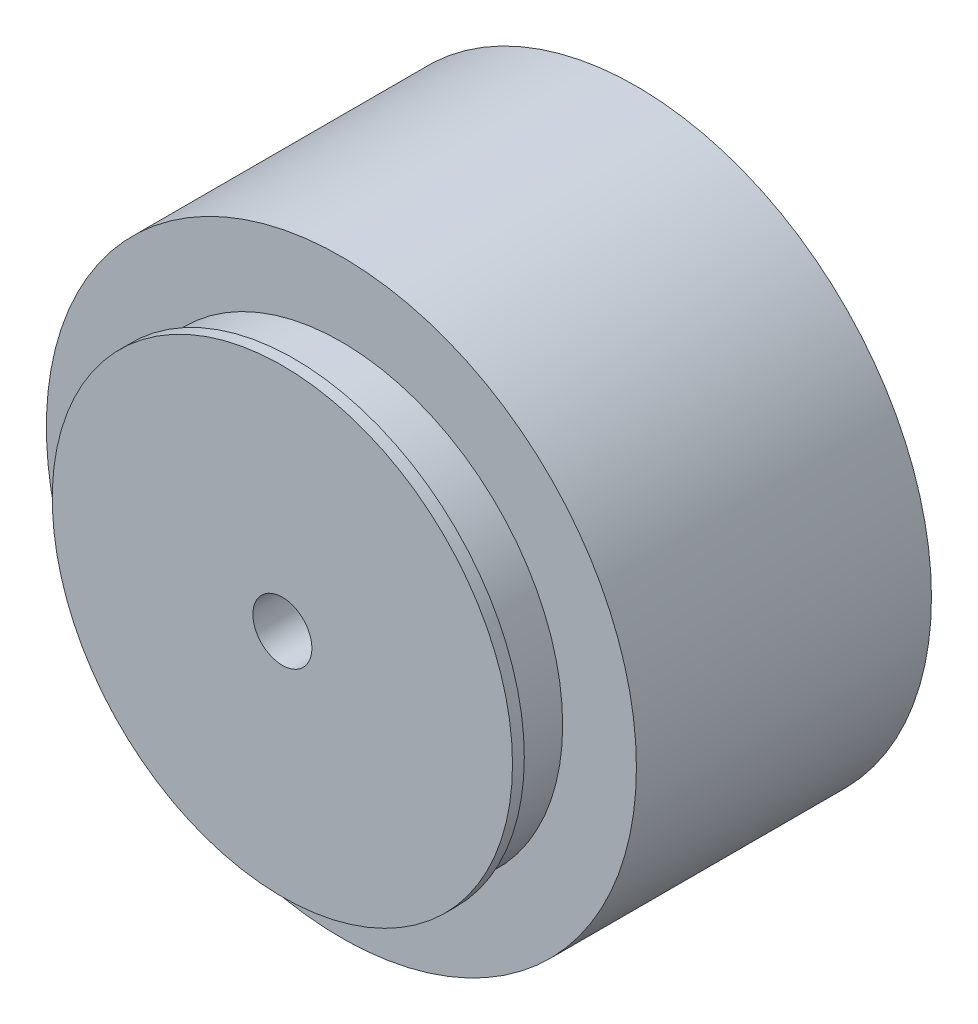
ISO-10303-21;
HEADER;
FILE_DESCRIPTION(('STEP AP214'),'2;1');
FILE_NAME('part.step','',(''),(''),'','','');
FILE_SCHEMA(('AUTOMOTIVE_DESIGN { 1 0 10303 214 1 1 1 1 }'));
ENDSEC;
DATA;
#1=APPLICATION_CONTEXT('core data for automotive mechanical design processes');
#2=APPLICATION_PROTOCOL_DEFINITION('international standard','automotive_design',2000,#1);
#3=PRODUCT_CONTEXT('',#1,'mechanical');
#4=PRODUCT('Part','Part','',(#3));
#5=PRODUCT_RELATED_PRODUCT_CATEGORY('part','',(#4));
#6=PRODUCT_DEFINITION_FORMATION('','',#4);
#7=PRODUCT_DEFINITION_CONTEXT('part definition',#1,'design');
#8=PRODUCT_DEFINITION('design','',#6,#7);
#9=PRODUCT_DEFINITION_SHAPE('','',#8);
#10=(LENGTH_UNIT() NAMED_UNIT(*) SI_UNIT(.MILLI.,.METRE.));
#11=(NAMED_UNIT(*) PLANE_ANGLE_UNIT() SI_UNIT($,.RADIAN.));
#12=(NAMED_UNIT(*) SI_UNIT($,.STERADIAN.) SOLID_ANGLE_UNIT());
#13=UNCERTAINTY_MEASURE_WITH_UNIT(LENGTH_MEASURE(1.E-05),#10,'distance_accuracy_value','');
#14=(GEOMETRIC_REPRESENTATION_CONTEXT(3) GLOBAL_UNCERTAINTY_ASSIGNED_CONTEXT((#13)) GLOBAL_UNIT_ASSIGNED_CONTEXT((#10,
#11,#12)) REPRESENTATION_CONTEXT('',''));
#15=CARTESIAN_POINT('',(0.,0.,0.));
#16=DIRECTION('',(0.,0.,1.));
#17=DIRECTION('',(1.,0.,0.));
#18=AXIS2_PLACEMENT_3D('',#15,#16,#17);
#19=CARTESIAN_POINT('',(0.,0.,0.));
#20=DIRECTION('',(0.,0.,1.));
#21=DIRECTION('',(1.,0.,0.));
#22=AXIS2_PLACEMENT_3D('',#19,#20,#21);
#23=PLANE('',#22);
#24=CARTESIAN_POINT('',(0.,0.,0.));
#25=DIRECTION('',(0.,0.,1.));
#26=DIRECTION('',(1.,0.,0.));
#27=AXIS2_PLACEMENT_3D('',#24,#25,#26);
#28=CIRCLE('',#27,50.);
#29=CARTESIAN_POINT('',(50.,0.,0.));
#30=VERTEX_POINT('',#29);
#31=EDGE_CURVE('E60',#30,#30,#28,.T.);
#32=ORIENTED_EDGE('',*,*,#31,.F.);
#33=EDGE_LOOP('',(#32));
#34=FACE_BOUND('',#33,.T.);
#35=CARTESIAN_POINT('',(0.,0.,0.));
#36=DIRECTION('',(0.,0.,1.));
#37=DIRECTION('',(1.,0.,0.));
#38=AXIS2_PLACEMENT_3D('',#35,#36,#37);
#39=CIRCLE('',#38,15.);
#40=CARTESIAN_POINT('',(15.,0.,0.));
#41=VERTEX_POINT('',#40);
#42=EDGE_CURVE('E10',#41,#41,#39,.F.);
#43=ORIENTED_EDGE('',*,*,#42,.F.);
#44=EDGE_LOOP('',(#43));
#45=FACE_BOUND('',#44,.T.);
#46=ADVANCED_FACE('F41',(#34,#45),#23,.F.);
#47=CARTESIAN_POINT('',(0.,0.,50.));
#48=DIRECTION('',(0.,0.,1.));
#49=DIRECTION('',(1.,0.,0.));
#50=AXIS2_PLACEMENT_3D('',#47,#48,#49);
#51=PLANE('',#50);
#52=CARTESIAN_POINT('',(0.,0.,50.));
#53=DIRECTION('',(0.,0.,1.));
#54=DIRECTION('',(1.,0.,0.));
#55=AXIS2_PLACEMENT_3D('',#52,#53,#54);
#56=CIRCLE('',#55,37.5);
#57=CARTESIAN_POINT('',(37.5,0.,50.));
#58=VERTEX_POINT('',#57);
#59=EDGE_CURVE('E49',#58,#58,#56,.T.);
#60=ORIENTED_EDGE('',*,*,#59,.F.);
#61=EDGE_LOOP('',(#60));
#62=FACE_BOUND('',#61,.T.);
#63=CARTESIAN_POINT('',(0.,0.,50.));
#64=DIRECTION('',(0.,0.,1.));
#65=DIRECTION('',(1.,0.,0.));
#66=AXIS2_PLACEMENT_3D('',#63,#64,#65);
#67=CIRCLE('',#66,50.);
#68=CARTESIAN_POINT('',(50.,0.,50.));
#69=VERTEX_POINT('',#68);
#70=EDGE_CURVE('E54',#69,#69,#67,.T.);
#71=ORIENTED_EDGE('',*,*,#70,.T.);
#72=EDGE_LOOP('',(#71));
#73=FACE_BOUND('',#72,.T.);
#74=ADVANCED_FACE('F114',(#62,#73),#51,.T.);
#75=CARTESIAN_POINT('',(0.,0.,50.));
#76=DIRECTION('',(0.,0.,-1.));
#77=DIRECTION('',(-1.,0.,0.));
#78=AXIS2_PLACEMENT_3D('',#75,#76,#77);
#79=CYLINDRICAL_SURFACE('',#78,50.);
#80=ORIENTED_EDGE('',*,*,#70,.F.);
#81=EDGE_LOOP('',(#80));
#82=FACE_BOUND('',#81,.T.);
#83=ORIENTED_EDGE('',*,*,#31,.T.);
#84=EDGE_LOOP('',(#83));
#85=FACE_BOUND('',#84,.T.);
#86=ADVANCED_FACE('F43',(#82,#85),#79,.T.);
#87=CARTESIAN_POINT('',(0.,0.,50.));
#88=DIRECTION('',(0.,0.,-1.));
#89=DIRECTION('',(-1.,0.,0.));
#90=AXIS2_PLACEMENT_3D('',#87,#88,#89);
#91=CYLINDRICAL_SURFACE('',#90,5.);
#92=CARTESIAN_POINT('',(0.,0.,60.));
#93=DIRECTION('',(0.,0.,1.));
#94=DIRECTION('',(1.,0.,0.));
#95=AXIS2_PLACEMENT_3D('',#92,#93,#94);
#96=CIRCLE('',#95,5.);
#97=CARTESIAN_POINT('',(5.,0.,60.));
#98=VERTEX_POINT('',#97);
#99=EDGE_CURVE('E82',#98,#98,#96,.T.);
#100=ORIENTED_EDGE('',*,*,#99,.T.);
#101=EDGE_LOOP('',(#100));
#102=FACE_BOUND('',#101,.T.);
#103=CARTESIAN_POINT('',(0.,0.,-10.));
#104=DIRECTION('',(0.,0.,-1.));
#105=DIRECTION('',(-1.,0.,0.));
#106=AXIS2_PLACEMENT_3D('',#103,#104,#105);
#107=CIRCLE('',#106,5.);
#108=CARTESIAN_POINT('',(-5.,0.,-10.));
#109=VERTEX_POINT('',#108);
#110=EDGE_CURVE('E91',#109,#109,#107,.T.);
#111=ORIENTED_EDGE('',*,*,#110,.T.);
#112=EDGE_LOOP('',(#111));
#113=FACE_BOUND('',#112,.T.);
#114=ADVANCED_FACE('F96',(#102,#113),#91,.F.);
#115=CARTESIAN_POINT('',(0.,0.,58.));
#116=DIRECTION('',(0.,0.,-1.));
#117=DIRECTION('',(-1.,0.,0.));
#118=AXIS2_PLACEMENT_3D('',#115,#116,#117);
#119=CYLINDRICAL_SURFACE('',#118,37.5);
#120=CARTESIAN_POINT('',(0.,0.,58.));
#121=DIRECTION('',(0.,0.,1.));
#122=DIRECTION('',(1.,0.,0.));
#123=AXIS2_PLACEMENT_3D('',#120,#121,#122);
#124=CIRCLE('',#123,37.5);
#125=CARTESIAN_POINT('',(37.5,0.,58.));
#126=VERTEX_POINT('',#125);
#127=EDGE_CURVE('E63',#126,#126,#124,.T.);
#128=ORIENTED_EDGE('',*,*,#127,.F.);
#129=EDGE_LOOP('',(#128));
#130=FACE_BOUND('',#129,.T.);
#131=ORIENTED_EDGE('',*,*,#59,.T.);
#132=EDGE_LOOP('',(#131));
#133=FACE_BOUND('',#132,.T.);
#134=ADVANCED_FACE('F125',(#130,#133),#119,.T.);
#135=CARTESIAN_POINT('',(0.,0.,60.));
#136=DIRECTION('',(0.,0.,1.));
#137=DIRECTION('',(1.,0.,0.));
#138=AXIS2_PLACEMENT_3D('',#135,#136,#137);
#139=PLANE('',#138);
#140=CARTESIAN_POINT('',(0.,0.,60.));
#141=DIRECTION('',(0.,0.,1.));
#142=DIRECTION('',(1.,0.,0.));
#143=AXIS2_PLACEMENT_3D('',#140,#141,#142);
#144=CIRCLE('',#143,39.);
#145=CARTESIAN_POINT('',(39.,0.,60.));
#146=VERTEX_POINT('',#145);
#147=EDGE_CURVE('E71',#146,#146,#144,.T.);
#148=ORIENTED_EDGE('',*,*,#147,.T.);
#149=EDGE_LOOP('',(#148));
#150=FACE_BOUND('',#149,.T.);
#151=ORIENTED_EDGE('',*,*,#99,.F.);
#152=EDGE_LOOP('',(#151));
#153=FACE_BOUND('',#152,.T.);
#154=ADVANCED_FACE('F128',(#150,#153),#139,.T.);
#155=CARTESIAN_POINT('',(0.,0.,58.));
#156=DIRECTION('',(0.,0.,1.));
#157=DIRECTION('',(1.,0.,0.));
#158=AXIS2_PLACEMENT_3D('',#155,#156,#157);
#159=PLANE('',#158);
#160=ORIENTED_EDGE('',*,*,#127,.T.);
#161=EDGE_LOOP('',(#160));
#162=FACE_BOUND('',#161,.T.);
#163=CARTESIAN_POINT('',(0.,0.,58.));
#164=DIRECTION('',(0.,0.,1.));
#165=DIRECTION('',(1.,0.,0.));
#166=AXIS2_PLACEMENT_3D('',#163,#164,#165);
#167=CIRCLE('',#166,39.);
#168=CARTESIAN_POINT('',(39.,0.,58.));
#169=VERTEX_POINT('',#168);
#170=EDGE_CURVE('E76',#169,#169,#167,.T.);
#171=ORIENTED_EDGE('',*,*,#170,.F.);
#172=EDGE_LOOP('',(#171));
#173=FACE_BOUND('',#172,.T.);
#174=ADVANCED_FACE('F110',(#162,#173),#159,.F.);
#175=CARTESIAN_POINT('',(0.,0.,60.));
#176=DIRECTION('',(0.,0.,-1.));
#177=DIRECTION('',(-1.,0.,0.));
#178=AXIS2_PLACEMENT_3D('',#175,#176,#177);
#179=CYLINDRICAL_SURFACE('',#178,39.);
#180=ORIENTED_EDGE('',*,*,#147,.F.);
#181=EDGE_LOOP('',(#180));
#182=FACE_BOUND('',#181,.T.);
#183=ORIENTED_EDGE('',*,*,#170,.T.);
#184=EDGE_LOOP('',(#183));
#185=FACE_BOUND('',#184,.T.);
#186=ADVANCED_FACE('F101',(#182,#185),#179,.T.);
#187=CARTESIAN_POINT('',(0.,0.,-10.));
#188=DIRECTION('',(0.,0.,-1.));
#189=DIRECTION('',(-1.,0.,0.));
#190=AXIS2_PLACEMENT_3D('',#187,#188,#189);
#191=PLANE('',#190);
#192=CARTESIAN_POINT('',(0.,0.,-10.));
#193=DIRECTION('',(0.,0.,-1.));
#194=DIRECTION('',(-1.,0.,0.));
#195=AXIS2_PLACEMENT_3D('',#192,#193,#194);
#196=CIRCLE('',#195,15.);
#197=CARTESIAN_POINT('',(-15.,0.,-10.));
#198=VERTEX_POINT('',#197);
#199=EDGE_CURVE('E87',#198,#198,#196,.T.);
#200=ORIENTED_EDGE('',*,*,#199,.T.);
#201=EDGE_LOOP('',(#200));
#202=FACE_BOUND('',#201,.T.);
#203=ORIENTED_EDGE('',*,*,#110,.F.);
#204=EDGE_LOOP('',(#203));
#205=FACE_BOUND('',#204,.T.);
#206=ADVANCED_FACE('F98',(#202,#205),#191,.T.);
#207=CARTESIAN_POINT('',(0.,0.,-10.));
#208=DIRECTION('',(0.,0.,1.));
#209=DIRECTION('',(1.,0.,0.));
#210=AXIS2_PLACEMENT_3D('',#207,#208,#209);
#211=CYLINDRICAL_SURFACE('',#210,15.);
#212=ORIENTED_EDGE('',*,*,#199,.F.);
#213=EDGE_LOOP('',(#212));
#214=FACE_BOUND('',#213,.T.);
#215=ORIENTED_EDGE('',*,*,#42,.T.);
#216=EDGE_LOOP('',(#215));
#217=FACE_BOUND('',#216,.T.);
#218=ADVANCED_FACE('F100',(#214,#217),#211,.T.);
#219=CLOSED_SHELL('',(#46,#74,#86,#114,#134,#154,#174,#186,#206,#218));
#220=MANIFOLD_SOLID_BREP('B2',#219);
#221=ADVANCED_BREP_SHAPE_REPRESENTATION('',(#18,#220),#14);
#222=SHAPE_DEFINITION_REPRESENTATION(#9,#221);
ENDSEC;
END-ISO-10303-21;
